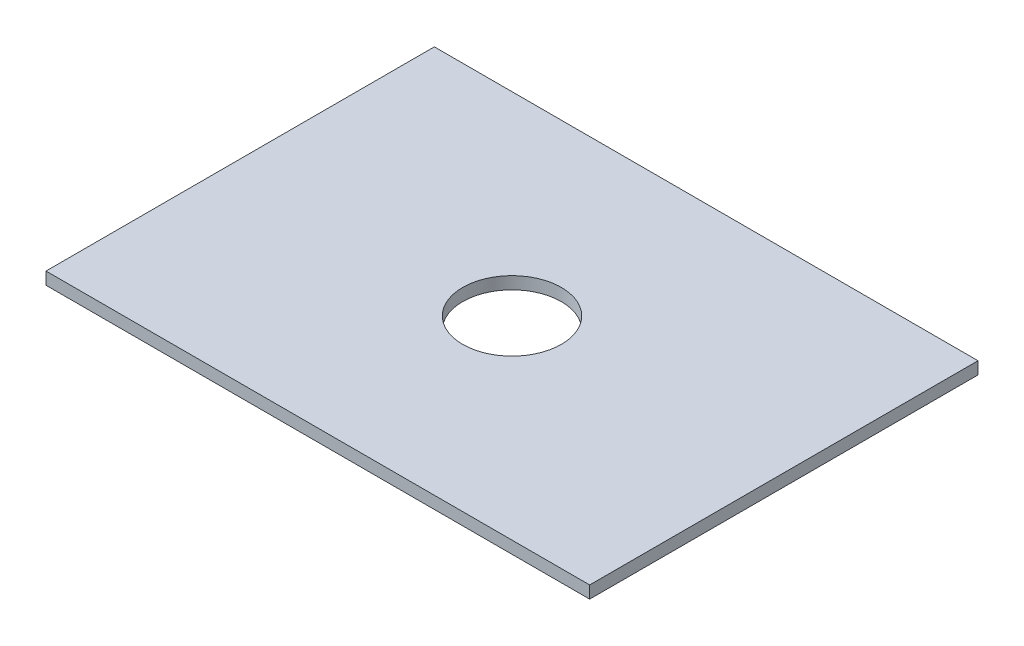
ISO-10303-21;
HEADER;
FILE_DESCRIPTION(('STEP AP214'),'2;1');
FILE_NAME('part.step','',(''),(''),'','','');
FILE_SCHEMA(('AUTOMOTIVE_DESIGN { 1 0 10303 214 1 1 1 1 }'));
ENDSEC;
DATA;
#1=APPLICATION_CONTEXT('core data for automotive mechanical design processes');
#2=APPLICATION_PROTOCOL_DEFINITION('international standard','automotive_design',2000,#1);
#3=PRODUCT_CONTEXT('',#1,'mechanical');
#4=PRODUCT('Part','Part','',(#3));
#5=PRODUCT_RELATED_PRODUCT_CATEGORY('part','',(#4));
#6=PRODUCT_DEFINITION_FORMATION('','',#4);
#7=PRODUCT_DEFINITION_CONTEXT('part definition',#1,'design');
#8=PRODUCT_DEFINITION('design','',#6,#7);
#9=PRODUCT_DEFINITION_SHAPE('','',#8);
#10=(LENGTH_UNIT() NAMED_UNIT(*) SI_UNIT(.MILLI.,.METRE.));
#11=(NAMED_UNIT(*) PLANE_ANGLE_UNIT() SI_UNIT($,.RADIAN.));
#12=(NAMED_UNIT(*) SI_UNIT($,.STERADIAN.) SOLID_ANGLE_UNIT());
#13=UNCERTAINTY_MEASURE_WITH_UNIT(LENGTH_MEASURE(1.E-05),#10,'distance_accuracy_value','');
#14=(GEOMETRIC_REPRESENTATION_CONTEXT(3) GLOBAL_UNCERTAINTY_ASSIGNED_CONTEXT((#13)) GLOBAL_UNIT_ASSIGNED_CONTEXT((#10,
#11,#12)) REPRESENTATION_CONTEXT('',''));
#15=CARTESIAN_POINT('',(0.,0.,0.));
#16=DIRECTION('',(0.,0.,1.));
#17=DIRECTION('',(1.,0.,0.));
#18=AXIS2_PLACEMENT_3D('',#15,#16,#17);
#19=CARTESIAN_POINT('',(0.,3.175,0.));
#20=DIRECTION('',(1.,0.,0.));
#21=DIRECTION('',(0.,0.,-1.));
#22=AXIS2_PLACEMENT_3D('',#19,#20,#21);
#23=PLANE('',#22);
#24=DIRECTION('',(0.,0.,1.));
#25=VECTOR('',#24,1.);
#26=CARTESIAN_POINT('',(0.,0.,0.));
#27=LINE('',#26,#25);
#28=CARTESIAN_POINT('',(0.,0.,-100.));
#29=VERTEX_POINT('',#28);
#30=CARTESIAN_POINT('',(0.,0.,0.));
#31=VERTEX_POINT('',#30);
#32=EDGE_CURVE('E98',#29,#31,#27,.T.);
#33=ORIENTED_EDGE('',*,*,#32,.T.);
#34=DIRECTION('',(0.,-1.,0.));
#35=VECTOR('',#34,1.);
#36=CARTESIAN_POINT('',(0.,3.175,0.));
#37=LINE('',#36,#35);
#38=CARTESIAN_POINT('',(0.,3.175,0.));
#39=VERTEX_POINT('',#38);
#40=EDGE_CURVE('E11',#39,#31,#37,.T.);
#41=ORIENTED_EDGE('',*,*,#40,.F.);
#42=DIRECTION('',(0.,0.,1.));
#43=VECTOR('',#42,1.);
#44=CARTESIAN_POINT('',(0.,3.175,0.));
#45=LINE('',#44,#43);
#46=CARTESIAN_POINT('',(0.,3.175,-100.));
#47=VERTEX_POINT('',#46);
#48=EDGE_CURVE('E85',#47,#39,#45,.T.);
#49=ORIENTED_EDGE('',*,*,#48,.F.);
#50=DIRECTION('',(0.,-1.,0.));
#51=VECTOR('',#50,1.);
#52=CARTESIAN_POINT('',(0.,3.175,-100.));
#53=LINE('',#52,#51);
#54=EDGE_CURVE('E94',#47,#29,#53,.T.);
#55=ORIENTED_EDGE('',*,*,#54,.T.);
#56=EDGE_LOOP('',(#33,#41,#49,#55));
#57=FACE_BOUND('',#56,.T.);
#58=ADVANCED_FACE('F33',(#57),#23,.F.);
#59=CARTESIAN_POINT('',(0.,3.175,0.));
#60=DIRECTION('',(0.,0.,-1.));
#61=DIRECTION('',(-1.,0.,0.));
#62=AXIS2_PLACEMENT_3D('',#59,#60,#61);
#63=PLANE('',#62);
#64=DIRECTION('',(1.,0.,0.));
#65=VECTOR('',#64,1.);
#66=CARTESIAN_POINT('',(0.,0.,0.));
#67=LINE('',#66,#65);
#68=CARTESIAN_POINT('',(140.,0.,0.));
#69=VERTEX_POINT('',#68);
#70=EDGE_CURVE('E89',#31,#69,#67,.T.);
#71=ORIENTED_EDGE('',*,*,#70,.T.);
#72=DIRECTION('',(0.,-1.,0.));
#73=VECTOR('',#72,1.);
#74=CARTESIAN_POINT('',(140.,3.175,0.));
#75=LINE('',#74,#73);
#76=CARTESIAN_POINT('',(140.,3.175,0.));
#77=VERTEX_POINT('',#76);
#78=EDGE_CURVE('E42',#77,#69,#75,.T.);
#79=ORIENTED_EDGE('',*,*,#78,.F.);
#80=DIRECTION('',(1.,0.,0.));
#81=VECTOR('',#80,1.);
#82=CARTESIAN_POINT('',(0.,3.175,0.));
#83=LINE('',#82,#81);
#84=EDGE_CURVE('E80',#39,#77,#83,.T.);
#85=ORIENTED_EDGE('',*,*,#84,.F.);
#86=ORIENTED_EDGE('',*,*,#40,.T.);
#87=EDGE_LOOP('',(#71,#79,#85,#86));
#88=FACE_BOUND('',#87,.T.);
#89=ADVANCED_FACE('F88',(#88),#63,.F.);
#90=CARTESIAN_POINT('',(140.,3.175,0.));
#91=DIRECTION('',(-1.,0.,0.));
#92=DIRECTION('',(0.,0.,1.));
#93=AXIS2_PLACEMENT_3D('',#90,#91,#92);
#94=PLANE('',#93);
#95=DIRECTION('',(0.,0.,-1.));
#96=VECTOR('',#95,1.);
#97=CARTESIAN_POINT('',(140.,0.,0.));
#98=LINE('',#97,#96);
#99=CARTESIAN_POINT('',(140.,0.,-100.));
#100=VERTEX_POINT('',#99);
#101=EDGE_CURVE('E67',#69,#100,#98,.T.);
#102=ORIENTED_EDGE('',*,*,#101,.T.);
#103=DIRECTION('',(0.,-1.,0.));
#104=VECTOR('',#103,1.);
#105=CARTESIAN_POINT('',(140.,3.175,-100.));
#106=LINE('',#105,#104);
#107=CARTESIAN_POINT('',(140.,3.175,-100.));
#108=VERTEX_POINT('',#107);
#109=EDGE_CURVE('E90',#108,#100,#106,.T.);
#110=ORIENTED_EDGE('',*,*,#109,.F.);
#111=DIRECTION('',(0.,0.,-1.));
#112=VECTOR('',#111,1.);
#113=CARTESIAN_POINT('',(140.,3.175,0.));
#114=LINE('',#113,#112);
#115=EDGE_CURVE('E83',#77,#108,#114,.T.);
#116=ORIENTED_EDGE('',*,*,#115,.F.);
#117=ORIENTED_EDGE('',*,*,#78,.T.);
#118=EDGE_LOOP('',(#102,#110,#116,#117));
#119=FACE_BOUND('',#118,.T.);
#120=ADVANCED_FACE('F92',(#119),#94,.F.);
#121=CARTESIAN_POINT('',(0.,3.175,-100.));
#122=DIRECTION('',(0.,0.,1.));
#123=DIRECTION('',(1.,0.,0.));
#124=AXIS2_PLACEMENT_3D('',#121,#122,#123);
#125=PLANE('',#124);
#126=DIRECTION('',(-1.,0.,0.));
#127=VECTOR('',#126,1.);
#128=CARTESIAN_POINT('',(0.,0.,-100.));
#129=LINE('',#128,#127);
#130=EDGE_CURVE('E73',#100,#29,#129,.T.);
#131=ORIENTED_EDGE('',*,*,#130,.T.);
#132=ORIENTED_EDGE('',*,*,#54,.F.);
#133=DIRECTION('',(-1.,0.,0.));
#134=VECTOR('',#133,1.);
#135=CARTESIAN_POINT('',(0.,3.175,-100.));
#136=LINE('',#135,#134);
#137=EDGE_CURVE('E50',#108,#47,#136,.T.);
#138=ORIENTED_EDGE('',*,*,#137,.F.);
#139=ORIENTED_EDGE('',*,*,#109,.T.);
#140=EDGE_LOOP('',(#131,#132,#138,#139));
#141=FACE_BOUND('',#140,.T.);
#142=ADVANCED_FACE('F105',(#141),#125,.F.);
#143=CARTESIAN_POINT('',(0.,3.175,0.));
#144=DIRECTION('',(0.,-1.,0.));
#145=DIRECTION('',(0.,0.,-1.));
#146=AXIS2_PLACEMENT_3D('',#143,#144,#145);
#147=PLANE('',#146);
#148=CARTESIAN_POINT('',(70.,3.175,-50.));
#149=DIRECTION('',(0.,1.,0.));
#150=DIRECTION('',(0.,0.,1.));
#151=AXIS2_PLACEMENT_3D('',#148,#149,#150);
#152=CIRCLE('',#151,12.705);
#153=CARTESIAN_POINT('',(70.,3.175,-37.295));
#154=VERTEX_POINT('',#153);
#155=EDGE_CURVE('E111',#154,#154,#152,.T.);
#156=ORIENTED_EDGE('',*,*,#155,.F.);
#157=EDGE_LOOP('',(#156));
#158=FACE_BOUND('',#157,.T.);
#159=ORIENTED_EDGE('',*,*,#48,.T.);
#160=ORIENTED_EDGE('',*,*,#84,.T.);
#161=ORIENTED_EDGE('',*,*,#115,.T.);
#162=ORIENTED_EDGE('',*,*,#137,.T.);
#163=EDGE_LOOP('',(#159,#160,#161,#162));
#164=FACE_BOUND('',#163,.T.);
#165=ADVANCED_FACE('F81',(#158,#164),#147,.F.);
#166=CARTESIAN_POINT('',(0.,0.,0.));
#167=DIRECTION('',(0.,-1.,0.));
#168=DIRECTION('',(0.,0.,-1.));
#169=AXIS2_PLACEMENT_3D('',#166,#167,#168);
#170=PLANE('',#169);
#171=CARTESIAN_POINT('',(70.,0.,-50.));
#172=DIRECTION('',(0.,-1.,0.));
#173=DIRECTION('',(0.,0.,-1.));
#174=AXIS2_PLACEMENT_3D('',#171,#172,#173);
#175=CIRCLE('',#174,12.705);
#176=CARTESIAN_POINT('',(70.,0.,-62.705));
#177=VERTEX_POINT('',#176);
#178=EDGE_CURVE('E36',#177,#177,#175,.T.);
#179=ORIENTED_EDGE('',*,*,#178,.F.);
#180=EDGE_LOOP('',(#179));
#181=FACE_BOUND('',#180,.T.);
#182=ORIENTED_EDGE('',*,*,#32,.F.);
#183=ORIENTED_EDGE('',*,*,#130,.F.);
#184=ORIENTED_EDGE('',*,*,#101,.F.);
#185=ORIENTED_EDGE('',*,*,#70,.F.);
#186=EDGE_LOOP('',(#182,#183,#184,#185));
#187=FACE_BOUND('',#186,.T.);
#188=ADVANCED_FACE('F108',(#181,#187),#170,.T.);
#189=CARTESIAN_POINT('',(70.,-6.825,-50.));
#190=DIRECTION('',(0.,1.,0.));
#191=DIRECTION('',(0.,0.,1.));
#192=AXIS2_PLACEMENT_3D('',#189,#190,#191);
#193=CYLINDRICAL_SURFACE('',#192,12.705);
#194=ORIENTED_EDGE('',*,*,#178,.T.);
#195=EDGE_LOOP('',(#194));
#196=FACE_BOUND('',#195,.T.);
#197=ORIENTED_EDGE('',*,*,#155,.T.);
#198=EDGE_LOOP('',(#197));
#199=FACE_BOUND('',#198,.T.);
#200=ADVANCED_FACE('F118',(#196,#199),#193,.F.);
#201=CLOSED_SHELL('',(#58,#89,#120,#142,#165,#188,#200));
#202=MANIFOLD_SOLID_BREP('B2',#201);
#203=ADVANCED_BREP_SHAPE_REPRESENTATION('',(#18,#202),#14);
#204=SHAPE_DEFINITION_REPRESENTATION(#9,#203);
ENDSEC;
END-ISO-10303-21;
